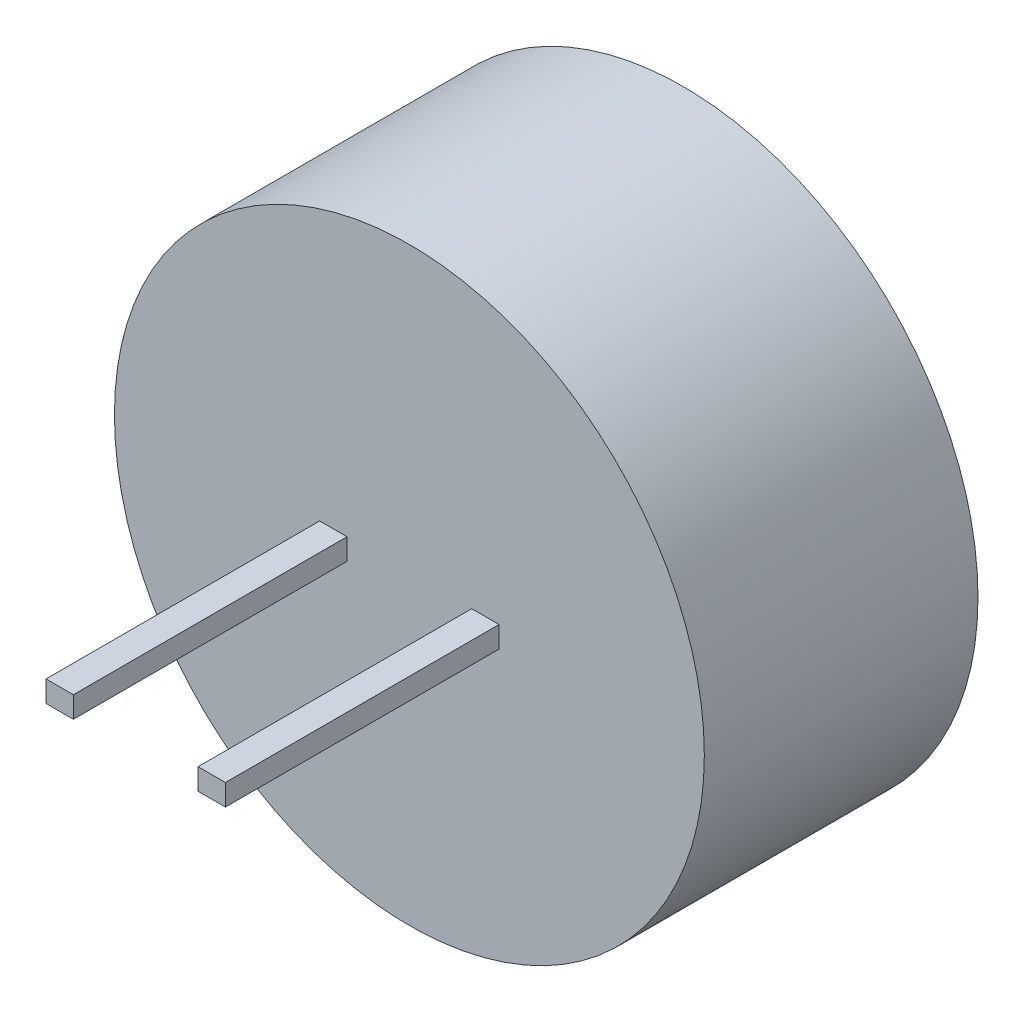
ISO-10303-21;
HEADER;
FILE_DESCRIPTION(('STEP AP214'),'2;1');
FILE_NAME('part.step','',(''),(''),'','','');
FILE_SCHEMA(('AUTOMOTIVE_DESIGN { 1 0 10303 214 1 1 1 1 }'));
ENDSEC;
DATA;
#1=APPLICATION_CONTEXT('core data for automotive mechanical design processes');
#2=APPLICATION_PROTOCOL_DEFINITION('international standard','automotive_design',2000,#1);
#3=PRODUCT_CONTEXT('',#1,'mechanical');
#4=PRODUCT('Part','Part','',(#3));
#5=PRODUCT_RELATED_PRODUCT_CATEGORY('part','',(#4));
#6=PRODUCT_DEFINITION_FORMATION('','',#4);
#7=PRODUCT_DEFINITION_CONTEXT('part definition',#1,'design');
#8=PRODUCT_DEFINITION('design','',#6,#7);
#9=PRODUCT_DEFINITION_SHAPE('','',#8);
#10=(LENGTH_UNIT() NAMED_UNIT(*) SI_UNIT(.MILLI.,.METRE.));
#11=(NAMED_UNIT(*) PLANE_ANGLE_UNIT() SI_UNIT($,.RADIAN.));
#12=(NAMED_UNIT(*) SI_UNIT($,.STERADIAN.) SOLID_ANGLE_UNIT());
#13=UNCERTAINTY_MEASURE_WITH_UNIT(LENGTH_MEASURE(1.E-05),#10,'distance_accuracy_value','');
#14=(GEOMETRIC_REPRESENTATION_CONTEXT(3) GLOBAL_UNCERTAINTY_ASSIGNED_CONTEXT((#13)) GLOBAL_UNIT_ASSIGNED_CONTEXT((#10,
#11,#12)) REPRESENTATION_CONTEXT('',''));
#15=CARTESIAN_POINT('',(0.,0.,0.));
#16=DIRECTION('',(0.,0.,1.));
#17=DIRECTION('',(1.,0.,0.));
#18=AXIS2_PLACEMENT_3D('',#15,#16,#17);
#19=CARTESIAN_POINT('',(0.,0.,4.5));
#20=DIRECTION('',(0.,0.,1.));
#21=DIRECTION('',(1.,0.,0.));
#22=AXIS2_PLACEMENT_3D('',#19,#20,#21);
#23=PLANE('',#22);
#24=CARTESIAN_POINT('',(0.,0.,4.5));
#25=DIRECTION('',(0.,0.,1.));
#26=DIRECTION('',(1.,0.,0.));
#27=AXIS2_PLACEMENT_3D('',#24,#25,#26);
#28=CIRCLE('',#27,4.85);
#29=CARTESIAN_POINT('',(4.85,0.,4.5));
#30=VERTEX_POINT('',#29);
#31=EDGE_CURVE('E11',#30,#30,#28,.T.);
#32=ORIENTED_EDGE('',*,*,#31,.T.);
#33=EDGE_LOOP('',(#32));
#34=FACE_BOUND('',#33,.T.);
#35=DIRECTION('',(0.,-1.,0.));
#36=VECTOR('',#35,1.);
#37=CARTESIAN_POINT('',(1.025,0.175,4.5));
#38=LINE('',#37,#36);
#39=CARTESIAN_POINT('',(1.025,0.175,4.5));
#40=VERTEX_POINT('',#39);
#41=CARTESIAN_POINT('',(1.025,-0.175,4.5));
#42=VERTEX_POINT('',#41);
#43=EDGE_CURVE('E168',#40,#42,#38,.T.);
#44=ORIENTED_EDGE('',*,*,#43,.F.);
#45=DIRECTION('',(-1.,0.,0.));
#46=VECTOR('',#45,1.);
#47=CARTESIAN_POINT('',(1.475,0.175,4.5));
#48=LINE('',#47,#46);
#49=CARTESIAN_POINT('',(1.475,0.175,4.5));
#50=VERTEX_POINT('',#49);
#51=EDGE_CURVE('E171',#50,#40,#48,.T.);
#52=ORIENTED_EDGE('',*,*,#51,.F.);
#53=DIRECTION('',(0.,1.,0.));
#54=VECTOR('',#53,1.);
#55=CARTESIAN_POINT('',(1.475,0.175,4.5));
#56=LINE('',#55,#54);
#57=CARTESIAN_POINT('',(1.475,-0.175,4.5));
#58=VERTEX_POINT('',#57);
#59=EDGE_CURVE('E161',#58,#50,#56,.T.);
#60=ORIENTED_EDGE('',*,*,#59,.F.);
#61=DIRECTION('',(1.,0.,0.));
#62=VECTOR('',#61,1.);
#63=CARTESIAN_POINT('',(1.475,-0.175,4.5));
#64=LINE('',#63,#62);
#65=EDGE_CURVE('E164',#42,#58,#64,.T.);
#66=ORIENTED_EDGE('',*,*,#65,.F.);
#67=EDGE_LOOP('',(#44,#52,#60,#66));
#68=FACE_BOUND('',#67,.T.);
#69=DIRECTION('',(-1.,0.,0.));
#70=VECTOR('',#69,1.);
#71=CARTESIAN_POINT('',(-1.475,0.175,4.5));
#72=LINE('',#71,#70);
#73=CARTESIAN_POINT('',(-1.025,0.175,4.5));
#74=VERTEX_POINT('',#73);
#75=CARTESIAN_POINT('',(-1.475,0.175,4.5));
#76=VERTEX_POINT('',#75);
#77=EDGE_CURVE('E209',#74,#76,#72,.T.);
#78=ORIENTED_EDGE('',*,*,#77,.F.);
#79=DIRECTION('',(0.,1.,0.));
#80=VECTOR('',#79,1.);
#81=CARTESIAN_POINT('',(-1.025,0.175,4.5));
#82=LINE('',#81,#80);
#83=CARTESIAN_POINT('',(-1.025,-0.175,4.5));
#84=VERTEX_POINT('',#83);
#85=EDGE_CURVE('E137',#84,#74,#82,.T.);
#86=ORIENTED_EDGE('',*,*,#85,.F.);
#87=DIRECTION('',(1.,0.,0.));
#88=VECTOR('',#87,1.);
#89=CARTESIAN_POINT('',(-1.475,-0.175,4.5));
#90=LINE('',#89,#88);
#91=CARTESIAN_POINT('',(-1.475,-0.175,4.5));
#92=VERTEX_POINT('',#91);
#93=EDGE_CURVE('E133',#92,#84,#90,.T.);
#94=ORIENTED_EDGE('',*,*,#93,.F.);
#95=DIRECTION('',(0.,-1.,0.));
#96=VECTOR('',#95,1.);
#97=CARTESIAN_POINT('',(-1.475,0.175,4.5));
#98=LINE('',#97,#96);
#99=EDGE_CURVE('E211',#76,#92,#98,.T.);
#100=ORIENTED_EDGE('',*,*,#99,.F.);
#101=EDGE_LOOP('',(#78,#86,#94,#100));
#102=FACE_BOUND('',#101,.T.);
#103=ADVANCED_FACE('F45',(#34,#68,#102),#23,.T.);
#104=CARTESIAN_POINT('',(0.,0.,4.5));
#105=DIRECTION('',(0.,0.,-1.));
#106=DIRECTION('',(-1.,0.,0.));
#107=AXIS2_PLACEMENT_3D('',#104,#105,#106);
#108=CYLINDRICAL_SURFACE('',#107,4.85);
#109=ORIENTED_EDGE('',*,*,#31,.F.);
#110=EDGE_LOOP('',(#109));
#111=FACE_BOUND('',#110,.T.);
#112=CARTESIAN_POINT('',(0.,0.,0.));
#113=DIRECTION('',(0.,0.,1.));
#114=DIRECTION('',(1.,0.,0.));
#115=AXIS2_PLACEMENT_3D('',#112,#113,#114);
#116=CIRCLE('',#115,4.85);
#117=CARTESIAN_POINT('',(4.85,0.,0.));
#118=VERTEX_POINT('',#117);
#119=EDGE_CURVE('E49',#118,#118,#116,.T.);
#120=ORIENTED_EDGE('',*,*,#119,.T.);
#121=EDGE_LOOP('',(#120));
#122=FACE_BOUND('',#121,.T.);
#123=ADVANCED_FACE('F47',(#111,#122),#108,.T.);
#124=CARTESIAN_POINT('',(0.,0.,0.));
#125=DIRECTION('',(0.,0.,1.));
#126=DIRECTION('',(1.,0.,0.));
#127=AXIS2_PLACEMENT_3D('',#124,#125,#126);
#128=PLANE('',#127);
#129=ORIENTED_EDGE('',*,*,#119,.F.);
#130=EDGE_LOOP('',(#129));
#131=FACE_BOUND('',#130,.T.);
#132=ADVANCED_FACE('F246',(#131),#128,.F.);
#133=CARTESIAN_POINT('',(1.475,0.175,9.));
#134=DIRECTION('',(0.,-1.,0.));
#135=DIRECTION('',(0.,0.,-1.));
#136=AXIS2_PLACEMENT_3D('',#133,#134,#135);
#137=PLANE('',#136);
#138=ORIENTED_EDGE('',*,*,#51,.T.);
#139=DIRECTION('',(0.,0.,-1.));
#140=VECTOR('',#139,1.);
#141=CARTESIAN_POINT('',(1.025,0.175,9.));
#142=LINE('',#141,#140);
#143=CARTESIAN_POINT('',(1.025,0.175,9.));
#144=VERTEX_POINT('',#143);
#145=EDGE_CURVE('E147',#144,#40,#142,.T.);
#146=ORIENTED_EDGE('',*,*,#145,.F.);
#147=DIRECTION('',(-1.,0.,0.));
#148=VECTOR('',#147,1.);
#149=CARTESIAN_POINT('',(1.475,0.175,9.));
#150=LINE('',#149,#148);
#151=CARTESIAN_POINT('',(1.475,0.175,9.));
#152=VERTEX_POINT('',#151);
#153=EDGE_CURVE('E165',#152,#144,#150,.T.);
#154=ORIENTED_EDGE('',*,*,#153,.F.);
#155=DIRECTION('',(0.,0.,-1.));
#156=VECTOR('',#155,1.);
#157=CARTESIAN_POINT('',(1.475,0.175,9.));
#158=LINE('',#157,#156);
#159=EDGE_CURVE('E156',#152,#50,#158,.T.);
#160=ORIENTED_EDGE('',*,*,#159,.T.);
#161=EDGE_LOOP('',(#138,#146,#154,#160));
#162=FACE_BOUND('',#161,.T.);
#163=ADVANCED_FACE('F192',(#162),#137,.F.);
#164=CARTESIAN_POINT('',(1.025,0.175,9.));
#165=DIRECTION('',(1.,0.,0.));
#166=DIRECTION('',(0.,1.,0.));
#167=AXIS2_PLACEMENT_3D('',#164,#165,#166);
#168=PLANE('',#167);
#169=ORIENTED_EDGE('',*,*,#43,.T.);
#170=DIRECTION('',(0.,0.,-1.));
#171=VECTOR('',#170,1.);
#172=CARTESIAN_POINT('',(1.025,-0.175,9.));
#173=LINE('',#172,#171);
#174=CARTESIAN_POINT('',(1.025,-0.175,9.));
#175=VERTEX_POINT('',#174);
#176=EDGE_CURVE('E150',#175,#42,#173,.T.);
#177=ORIENTED_EDGE('',*,*,#176,.F.);
#178=DIRECTION('',(0.,-1.,0.));
#179=VECTOR('',#178,1.);
#180=CARTESIAN_POINT('',(1.025,0.175,9.));
#181=LINE('',#180,#179);
#182=EDGE_CURVE('E180',#144,#175,#181,.T.);
#183=ORIENTED_EDGE('',*,*,#182,.F.);
#184=ORIENTED_EDGE('',*,*,#145,.T.);
#185=EDGE_LOOP('',(#169,#177,#183,#184));
#186=FACE_BOUND('',#185,.T.);
#187=ADVANCED_FACE('F196',(#186),#168,.F.);
#188=CARTESIAN_POINT('',(1.475,-0.175,9.));
#189=DIRECTION('',(0.,1.,0.));
#190=DIRECTION('',(0.,0.,1.));
#191=AXIS2_PLACEMENT_3D('',#188,#189,#190);
#192=PLANE('',#191);
#193=ORIENTED_EDGE('',*,*,#65,.T.);
#194=DIRECTION('',(0.,0.,-1.));
#195=VECTOR('',#194,1.);
#196=CARTESIAN_POINT('',(1.475,-0.175,9.));
#197=LINE('',#196,#195);
#198=CARTESIAN_POINT('',(1.475,-0.175,9.));
#199=VERTEX_POINT('',#198);
#200=EDGE_CURVE('E69',#199,#58,#197,.T.);
#201=ORIENTED_EDGE('',*,*,#200,.F.);
#202=DIRECTION('',(1.,0.,0.));
#203=VECTOR('',#202,1.);
#204=CARTESIAN_POINT('',(1.475,-0.175,9.));
#205=LINE('',#204,#203);
#206=EDGE_CURVE('E177',#175,#199,#205,.T.);
#207=ORIENTED_EDGE('',*,*,#206,.F.);
#208=ORIENTED_EDGE('',*,*,#176,.T.);
#209=EDGE_LOOP('',(#193,#201,#207,#208));
#210=FACE_BOUND('',#209,.T.);
#211=ADVANCED_FACE('F200',(#210),#192,.F.);
#212=CARTESIAN_POINT('',(1.475,0.175,9.));
#213=DIRECTION('',(-1.,0.,0.));
#214=DIRECTION('',(0.,0.,1.));
#215=AXIS2_PLACEMENT_3D('',#212,#213,#214);
#216=PLANE('',#215);
#217=ORIENTED_EDGE('',*,*,#59,.T.);
#218=ORIENTED_EDGE('',*,*,#159,.F.);
#219=DIRECTION('',(0.,1.,0.));
#220=VECTOR('',#219,1.);
#221=CARTESIAN_POINT('',(1.475,0.175,9.));
#222=LINE('',#221,#220);
#223=EDGE_CURVE('E160',#199,#152,#222,.T.);
#224=ORIENTED_EDGE('',*,*,#223,.F.);
#225=ORIENTED_EDGE('',*,*,#200,.T.);
#226=EDGE_LOOP('',(#217,#218,#224,#225));
#227=FACE_BOUND('',#226,.T.);
#228=ADVANCED_FACE('F202',(#227),#216,.F.);
#229=CARTESIAN_POINT('',(0.,0.,9.));
#230=DIRECTION('',(0.,0.,1.));
#231=DIRECTION('',(1.,0.,0.));
#232=AXIS2_PLACEMENT_3D('',#229,#230,#231);
#233=PLANE('',#232);
#234=ORIENTED_EDGE('',*,*,#153,.T.);
#235=ORIENTED_EDGE('',*,*,#182,.T.);
#236=ORIENTED_EDGE('',*,*,#206,.T.);
#237=ORIENTED_EDGE('',*,*,#223,.T.);
#238=EDGE_LOOP('',(#234,#235,#236,#237));
#239=FACE_BOUND('',#238,.T.);
#240=ADVANCED_FACE('F188',(#239),#233,.T.);
#241=CARTESIAN_POINT('',(-1.025,0.175,9.));
#242=DIRECTION('',(-1.,0.,0.));
#243=DIRECTION('',(0.,-1.,0.));
#244=AXIS2_PLACEMENT_3D('',#241,#242,#243);
#245=PLANE('',#244);
#246=ORIENTED_EDGE('',*,*,#85,.T.);
#247=DIRECTION('',(0.,0.,-1.));
#248=VECTOR('',#247,1.);
#249=CARTESIAN_POINT('',(-1.025,0.175,9.));
#250=LINE('',#249,#248);
#251=CARTESIAN_POINT('',(-1.025,0.175,9.));
#252=VERTEX_POINT('',#251);
#253=EDGE_CURVE('E116',#252,#74,#250,.T.);
#254=ORIENTED_EDGE('',*,*,#253,.F.);
#255=DIRECTION('',(0.,1.,0.));
#256=VECTOR('',#255,1.);
#257=CARTESIAN_POINT('',(-1.025,0.175,9.));
#258=LINE('',#257,#256);
#259=CARTESIAN_POINT('',(-1.025,-0.175,9.));
#260=VERTEX_POINT('',#259);
#261=EDGE_CURVE('E124',#260,#252,#258,.T.);
#262=ORIENTED_EDGE('',*,*,#261,.F.);
#263=DIRECTION('',(0.,0.,-1.));
#264=VECTOR('',#263,1.);
#265=CARTESIAN_POINT('',(-1.025,-0.175,9.));
#266=LINE('',#265,#264);
#267=EDGE_CURVE('E222',#260,#84,#266,.T.);
#268=ORIENTED_EDGE('',*,*,#267,.T.);
#269=EDGE_LOOP('',(#246,#254,#262,#268));
#270=FACE_BOUND('',#269,.T.);
#271=ADVANCED_FACE('F135',(#270),#245,.F.);
#272=CARTESIAN_POINT('',(-1.475,0.175,9.));
#273=DIRECTION('',(0.,-1.,0.));
#274=DIRECTION('',(0.,0.,-1.));
#275=AXIS2_PLACEMENT_3D('',#272,#273,#274);
#276=PLANE('',#275);
#277=ORIENTED_EDGE('',*,*,#77,.T.);
#278=DIRECTION('',(0.,0.,-1.));
#279=VECTOR('',#278,1.);
#280=CARTESIAN_POINT('',(-1.475,0.175,9.));
#281=LINE('',#280,#279);
#282=CARTESIAN_POINT('',(-1.475,0.175,9.));
#283=VERTEX_POINT('',#282);
#284=EDGE_CURVE('E119',#283,#76,#281,.T.);
#285=ORIENTED_EDGE('',*,*,#284,.F.);
#286=DIRECTION('',(-1.,0.,0.));
#287=VECTOR('',#286,1.);
#288=CARTESIAN_POINT('',(-1.475,0.175,9.));
#289=LINE('',#288,#287);
#290=EDGE_CURVE('E112',#252,#283,#289,.T.);
#291=ORIENTED_EDGE('',*,*,#290,.F.);
#292=ORIENTED_EDGE('',*,*,#253,.T.);
#293=EDGE_LOOP('',(#277,#285,#291,#292));
#294=FACE_BOUND('',#293,.T.);
#295=ADVANCED_FACE('F114',(#294),#276,.F.);
#296=CARTESIAN_POINT('',(-1.475,0.175,9.));
#297=DIRECTION('',(1.,0.,0.));
#298=DIRECTION('',(0.,0.,-1.));
#299=AXIS2_PLACEMENT_3D('',#296,#297,#298);
#300=PLANE('',#299);
#301=ORIENTED_EDGE('',*,*,#99,.T.);
#302=DIRECTION('',(0.,0.,-1.));
#303=VECTOR('',#302,1.);
#304=CARTESIAN_POINT('',(-1.475,-0.175,9.));
#305=LINE('',#304,#303);
#306=CARTESIAN_POINT('',(-1.475,-0.175,9.));
#307=VERTEX_POINT('',#306);
#308=EDGE_CURVE('E61',#307,#92,#305,.T.);
#309=ORIENTED_EDGE('',*,*,#308,.F.);
#310=DIRECTION('',(0.,-1.,0.));
#311=VECTOR('',#310,1.);
#312=CARTESIAN_POINT('',(-1.475,0.175,9.));
#313=LINE('',#312,#311);
#314=EDGE_CURVE('E123',#283,#307,#313,.T.);
#315=ORIENTED_EDGE('',*,*,#314,.F.);
#316=ORIENTED_EDGE('',*,*,#284,.T.);
#317=EDGE_LOOP('',(#301,#309,#315,#316));
#318=FACE_BOUND('',#317,.T.);
#319=ADVANCED_FACE('F229',(#318),#300,.F.);
#320=CARTESIAN_POINT('',(-1.475,-0.175,9.));
#321=DIRECTION('',(0.,1.,0.));
#322=DIRECTION('',(0.,0.,1.));
#323=AXIS2_PLACEMENT_3D('',#320,#321,#322);
#324=PLANE('',#323);
#325=ORIENTED_EDGE('',*,*,#93,.T.);
#326=ORIENTED_EDGE('',*,*,#267,.F.);
#327=DIRECTION('',(1.,0.,0.));
#328=VECTOR('',#327,1.);
#329=CARTESIAN_POINT('',(-1.475,-0.175,9.));
#330=LINE('',#329,#328);
#331=EDGE_CURVE('E128',#307,#260,#330,.T.);
#332=ORIENTED_EDGE('',*,*,#331,.F.);
#333=ORIENTED_EDGE('',*,*,#308,.T.);
#334=EDGE_LOOP('',(#325,#326,#332,#333));
#335=FACE_BOUND('',#334,.T.);
#336=ADVANCED_FACE('F230',(#335),#324,.F.);
#337=CARTESIAN_POINT('',(0.,0.,9.));
#338=DIRECTION('',(0.,0.,1.));
#339=DIRECTION('',(1.,0.,0.));
#340=AXIS2_PLACEMENT_3D('',#337,#338,#339);
#341=PLANE('',#340);
#342=ORIENTED_EDGE('',*,*,#261,.T.);
#343=ORIENTED_EDGE('',*,*,#290,.T.);
#344=ORIENTED_EDGE('',*,*,#314,.T.);
#345=ORIENTED_EDGE('',*,*,#331,.T.);
#346=EDGE_LOOP('',(#342,#343,#344,#345));
#347=FACE_BOUND('',#346,.T.);
#348=ADVANCED_FACE('F127',(#347),#341,.T.);
#349=CLOSED_SHELL('',(#103,#123,#132,#163,#187,#211,#228,#240,#271,#295,#319,#336,#348));
#350=MANIFOLD_SOLID_BREP('B2',#349);
#351=ADVANCED_BREP_SHAPE_REPRESENTATION('',(#18,#350),#14);
#352=SHAPE_DEFINITION_REPRESENTATION(#9,#351);
ENDSEC;
END-ISO-10303-21;
